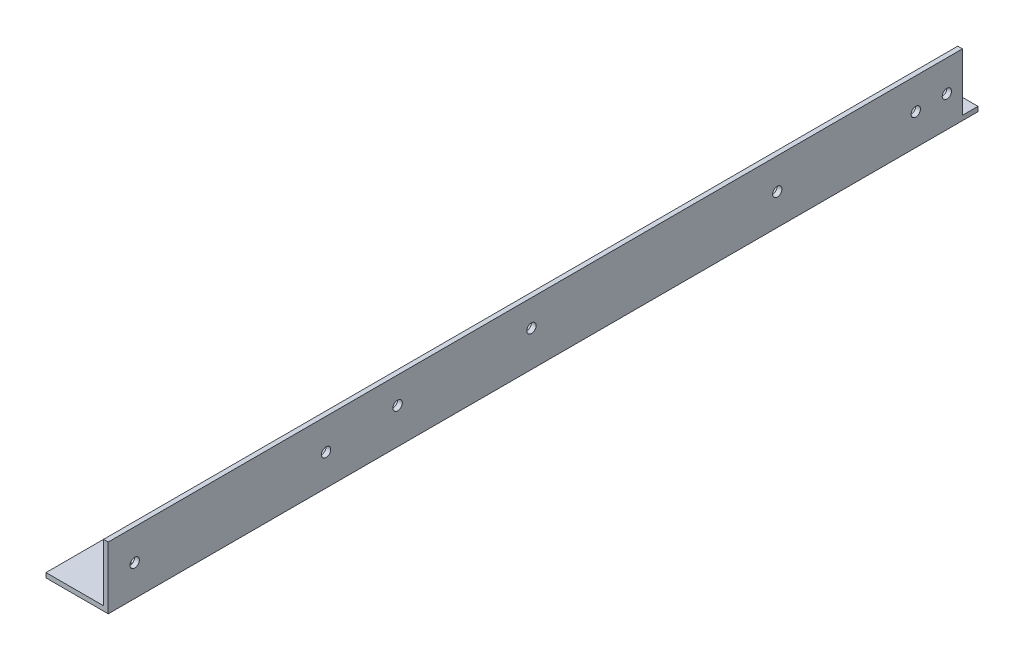
ISO-10303-21;
HEADER;
FILE_DESCRIPTION(('STEP AP214'),'2;1');
FILE_NAME('part.step','',(''),(''),'','','');
FILE_SCHEMA(('AUTOMOTIVE_DESIGN { 1 0 10303 214 1 1 1 1 }'));
ENDSEC;
DATA;
#1=APPLICATION_CONTEXT('core data for automotive mechanical design processes');
#2=APPLICATION_PROTOCOL_DEFINITION('international standard','automotive_design',2000,#1);
#3=PRODUCT_CONTEXT('',#1,'mechanical');
#4=PRODUCT('Part','Part','',(#3));
#5=PRODUCT_RELATED_PRODUCT_CATEGORY('part','',(#4));
#6=PRODUCT_DEFINITION_FORMATION('','',#4);
#7=PRODUCT_DEFINITION_CONTEXT('part definition',#1,'design');
#8=PRODUCT_DEFINITION('design','',#6,#7);
#9=PRODUCT_DEFINITION_SHAPE('','',#8);
#10=(LENGTH_UNIT() NAMED_UNIT(*) SI_UNIT(.MILLI.,.METRE.));
#11=(NAMED_UNIT(*) PLANE_ANGLE_UNIT() SI_UNIT($,.RADIAN.));
#12=(NAMED_UNIT(*) SI_UNIT($,.STERADIAN.) SOLID_ANGLE_UNIT());
#13=UNCERTAINTY_MEASURE_WITH_UNIT(LENGTH_MEASURE(1.E-05),#10,'distance_accuracy_value','');
#14=(GEOMETRIC_REPRESENTATION_CONTEXT(3) GLOBAL_UNCERTAINTY_ASSIGNED_CONTEXT((#13)) GLOBAL_UNIT_ASSIGNED_CONTEXT((#10,
#11,#12)) REPRESENTATION_CONTEXT('',''));
#15=CARTESIAN_POINT('',(0.,0.,0.));
#16=DIRECTION('',(0.,0.,1.));
#17=DIRECTION('',(1.,0.,0.));
#18=AXIS2_PLACEMENT_3D('',#15,#16,#17);
#19=CARTESIAN_POINT('',(2.56831362016425,-15.2266315789474,0.));
#20=DIRECTION('',(0.,0.,1.));
#21=DIRECTION('',(1.,0.,0.));
#22=AXIS2_PLACEMENT_3D('',#19,#20,#21);
#23=PLANE('',#22);
#24=DIRECTION('',(1.,0.,0.));
#25=VECTOR('',#24,1.);
#26=CARTESIAN_POINT('',(-17.4316863798357,-13.7266315789474,0.));
#27=LINE('',#26,#25);
#28=CARTESIAN_POINT('',(1.06831362016425,-13.7266315789474,0.));
#29=VERTEX_POINT('',#28);
#30=CARTESIAN_POINT('',(2.56831362016425,-13.7266315789474,0.));
#31=VERTEX_POINT('',#30);
#32=EDGE_CURVE('E11',#29,#31,#27,.T.);
#33=ORIENTED_EDGE('',*,*,#32,.F.);
#34=DIRECTION('',(0.,-1.,0.));
#35=VECTOR('',#34,1.);
#36=CARTESIAN_POINT('',(1.06831362016425,4.77336842105263,0.));
#37=LINE('',#36,#35);
#38=CARTESIAN_POINT('',(1.06831362016425,4.77336842105263,0.));
#39=VERTEX_POINT('',#38);
#40=EDGE_CURVE('E102',#39,#29,#37,.T.);
#41=ORIENTED_EDGE('',*,*,#40,.F.);
#42=DIRECTION('',(-1.,0.,0.));
#43=VECTOR('',#42,1.);
#44=CARTESIAN_POINT('',(2.56831362016425,4.77336842105263,0.));
#45=LINE('',#44,#43);
#46=CARTESIAN_POINT('',(2.56831362016425,4.77336842105263,0.));
#47=VERTEX_POINT('',#46);
#48=EDGE_CURVE('E64',#47,#39,#45,.T.);
#49=ORIENTED_EDGE('',*,*,#48,.F.);
#50=DIRECTION('',(0.,1.,0.));
#51=VECTOR('',#50,1.);
#52=CARTESIAN_POINT('',(2.56831362016425,-15.2266315789474,0.));
#53=LINE('',#52,#51);
#54=EDGE_CURVE('E118',#31,#47,#53,.T.);
#55=ORIENTED_EDGE('',*,*,#54,.F.);
#56=EDGE_LOOP('',(#33,#41,#49,#55));
#57=FACE_BOUND('',#56,.T.);
#58=ADVANCED_FACE('F30',(#57),#23,.F.);
#59=CARTESIAN_POINT('',(-17.4316863798357,-15.2266315789474,274.5));
#60=DIRECTION('',(0.,1.,0.));
#61=DIRECTION('',(0.,0.,1.));
#62=AXIS2_PLACEMENT_3D('',#59,#60,#61);
#63=PLANE('',#62);
#64=CARTESIAN_POINT('',(-7.43168637983575,-15.2266315789474,59.5));
#65=DIRECTION('',(0.,1.,0.));
#66=DIRECTION('',(0.,0.,1.));
#67=AXIS2_PLACEMENT_3D('',#64,#65,#66);
#68=CIRCLE('',#67,1.5);
#69=CARTESIAN_POINT('',(-7.43168637983575,-15.2266315789474,61.));
#70=VERTEX_POINT('',#69);
#71=EDGE_CURVE('E162',#70,#70,#68,.T.);
#72=ORIENTED_EDGE('',*,*,#71,.T.);
#73=EDGE_LOOP('',(#72));
#74=FACE_BOUND('',#73,.T.);
#75=CARTESIAN_POINT('',(-7.43168637983575,-15.2266315789474,204.5));
#76=DIRECTION('',(0.,1.,0.));
#77=DIRECTION('',(0.,0.,1.));
#78=AXIS2_PLACEMENT_3D('',#75,#76,#77);
#79=CIRCLE('',#78,1.5);
#80=CARTESIAN_POINT('',(-7.43168637983575,-15.2266315789474,206.));
#81=VERTEX_POINT('',#80);
#82=EDGE_CURVE('E168',#81,#81,#79,.T.);
#83=ORIENTED_EDGE('',*,*,#82,.T.);
#84=EDGE_LOOP('',(#83));
#85=FACE_BOUND('',#84,.T.);
#86=CARTESIAN_POINT('',(-4.93168637983575,-15.2266315789474,259.5));
#87=DIRECTION('',(0.,1.,0.));
#88=DIRECTION('',(0.,0.,1.));
#89=AXIS2_PLACEMENT_3D('',#86,#87,#88);
#90=CIRCLE('',#89,2.);
#91=CARTESIAN_POINT('',(-4.93168637983575,-15.2266315789474,261.5));
#92=VERTEX_POINT('',#91);
#93=EDGE_CURVE('E174',#92,#92,#90,.T.);
#94=ORIENTED_EDGE('',*,*,#93,.T.);
#95=EDGE_LOOP('',(#94));
#96=FACE_BOUND('',#95,.T.);
#97=CARTESIAN_POINT('',(-4.93168637983575,-15.2266315789474,248.5));
#98=DIRECTION('',(0.,1.,0.));
#99=DIRECTION('',(0.,0.,1.));
#100=AXIS2_PLACEMENT_3D('',#97,#98,#99);
#101=CIRCLE('',#100,2.);
#102=CARTESIAN_POINT('',(-4.93168637983575,-15.2266315789474,250.5));
#103=VERTEX_POINT('',#102);
#104=EDGE_CURVE('E180',#103,#103,#101,.T.);
#105=ORIENTED_EDGE('',*,*,#104,.T.);
#106=EDGE_LOOP('',(#105));
#107=FACE_BOUND('',#106,.T.);
#108=CARTESIAN_POINT('',(-4.93168637983575,-15.2266315789474,15.5));
#109=DIRECTION('',(0.,1.,0.));
#110=DIRECTION('',(0.,0.,1.));
#111=AXIS2_PLACEMENT_3D('',#108,#109,#110);
#112=CIRCLE('',#111,2.);
#113=CARTESIAN_POINT('',(-4.93168637983575,-15.2266315789474,17.5));
#114=VERTEX_POINT('',#113);
#115=EDGE_CURVE('E186',#114,#114,#112,.T.);
#116=ORIENTED_EDGE('',*,*,#115,.T.);
#117=EDGE_LOOP('',(#116));
#118=FACE_BOUND('',#117,.T.);
#119=CARTESIAN_POINT('',(-4.93168637983575,-15.2266315789474,4.5));
#120=DIRECTION('',(0.,1.,0.));
#121=DIRECTION('',(0.,0.,1.));
#122=AXIS2_PLACEMENT_3D('',#119,#120,#121);
#123=CIRCLE('',#122,2.);
#124=CARTESIAN_POINT('',(-4.93168637983575,-15.2266315789474,6.5));
#125=VERTEX_POINT('',#124);
#126=EDGE_CURVE('E120',#125,#125,#123,.T.);
#127=ORIENTED_EDGE('',*,*,#126,.T.);
#128=EDGE_LOOP('',(#127));
#129=FACE_BOUND('',#128,.T.);
#130=DIRECTION('',(0.,0.,-1.));
#131=VECTOR('',#130,1.);
#132=CARTESIAN_POINT('',(-17.4316863798357,-15.2266315789474,274.5));
#133=LINE('',#132,#131);
#134=CARTESIAN_POINT('',(-17.4316863798357,-15.2266315789474,274.5));
#135=VERTEX_POINT('',#134);
#136=CARTESIAN_POINT('',(-17.4316863798357,-15.2266315789474,-5.));
#137=VERTEX_POINT('',#136);
#138=EDGE_CURVE('E110',#135,#137,#133,.T.);
#139=ORIENTED_EDGE('',*,*,#138,.T.);
#140=DIRECTION('',(-1.,0.,0.));
#141=VECTOR('',#140,1.);
#142=CARTESIAN_POINT('',(-17.4316863798357,-15.2266315789474,-5.));
#143=LINE('',#142,#141);
#144=CARTESIAN_POINT('',(2.56831362016425,-15.2266315789474,-5.));
#145=VERTEX_POINT('',#144);
#146=EDGE_CURVE('E130',#145,#137,#143,.T.);
#147=ORIENTED_EDGE('',*,*,#146,.F.);
#148=DIRECTION('',(0.,0.,-1.));
#149=VECTOR('',#148,1.);
#150=CARTESIAN_POINT('',(2.56831362016425,-15.2266315789474,274.5));
#151=LINE('',#150,#149);
#152=CARTESIAN_POINT('',(2.56831362016425,-15.2266315789474,274.5));
#153=VERTEX_POINT('',#152);
#154=EDGE_CURVE('E40',#153,#145,#151,.T.);
#155=ORIENTED_EDGE('',*,*,#154,.F.);
#156=DIRECTION('',(1.,0.,0.));
#157=VECTOR('',#156,1.);
#158=CARTESIAN_POINT('',(-17.4316863798357,-15.2266315789474,274.5));
#159=LINE('',#158,#157);
#160=EDGE_CURVE('E194',#135,#153,#159,.T.);
#161=ORIENTED_EDGE('',*,*,#160,.F.);
#162=EDGE_LOOP('',(#139,#147,#155,#161));
#163=FACE_BOUND('',#162,.T.);
#164=ADVANCED_FACE('F32',(#74,#85,#96,#107,#118,#129,#163),#63,.F.);
#165=CARTESIAN_POINT('',(2.56831362016425,-15.2266315789474,274.5));
#166=DIRECTION('',(-1.,0.,0.));
#167=DIRECTION('',(0.,0.,1.));
#168=AXIS2_PLACEMENT_3D('',#165,#166,#167);
#169=PLANE('',#168);
#170=CARTESIAN_POINT('',(2.56831362016425,-3.72663157894737,138.5));
#171=DIRECTION('',(1.,0.,0.));
#172=DIRECTION('',(0.,0.,-1.));
#173=AXIS2_PLACEMENT_3D('',#170,#171,#172);
#174=CIRCLE('',#173,1.5);
#175=CARTESIAN_POINT('',(2.56831362016425,-3.72663157894737,137.));
#176=VERTEX_POINT('',#175);
#177=EDGE_CURVE('E132',#176,#176,#174,.T.);
#178=ORIENTED_EDGE('',*,*,#177,.F.);
#179=EDGE_LOOP('',(#178));
#180=FACE_BOUND('',#179,.T.);
#181=CARTESIAN_POINT('',(2.56831362016425,-3.72663157894737,181.5));
#182=DIRECTION('',(1.,0.,0.));
#183=DIRECTION('',(0.,0.,-1.));
#184=AXIS2_PLACEMENT_3D('',#181,#182,#183);
#185=CIRCLE('',#184,1.5);
#186=CARTESIAN_POINT('',(2.56831362016425,-3.72663157894737,180.));
#187=VERTEX_POINT('',#186);
#188=EDGE_CURVE('E135',#187,#187,#185,.T.);
#189=ORIENTED_EDGE('',*,*,#188,.F.);
#190=EDGE_LOOP('',(#189));
#191=FACE_BOUND('',#190,.T.);
#192=CARTESIAN_POINT('',(2.56831362016425,-5.22663157894737,204.5));
#193=DIRECTION('',(1.,0.,0.));
#194=DIRECTION('',(0.,0.,-1.));
#195=AXIS2_PLACEMENT_3D('',#192,#193,#194);
#196=CIRCLE('',#195,1.5);
#197=CARTESIAN_POINT('',(2.56831362016425,-5.22663157894737,203.));
#198=VERTEX_POINT('',#197);
#199=EDGE_CURVE('E139',#198,#198,#196,.T.);
#200=ORIENTED_EDGE('',*,*,#199,.F.);
#201=EDGE_LOOP('',(#200));
#202=FACE_BOUND('',#201,.T.);
#203=CARTESIAN_POINT('',(2.56831362016425,-5.22663157894737,59.5));
#204=DIRECTION('',(1.,0.,0.));
#205=DIRECTION('',(0.,0.,-1.));
#206=AXIS2_PLACEMENT_3D('',#203,#204,#205);
#207=CIRCLE('',#206,1.5);
#208=CARTESIAN_POINT('',(2.56831362016425,-5.22663157894737,58.));
#209=VERTEX_POINT('',#208);
#210=EDGE_CURVE('E143',#209,#209,#207,.T.);
#211=ORIENTED_EDGE('',*,*,#210,.F.);
#212=EDGE_LOOP('',(#211));
#213=FACE_BOUND('',#212,.T.);
#214=CARTESIAN_POINT('',(2.56831362016425,-5.22663157894737,15.));
#215=DIRECTION('',(1.,0.,0.));
#216=DIRECTION('',(0.,0.,-1.));
#217=AXIS2_PLACEMENT_3D('',#214,#215,#216);
#218=CIRCLE('',#217,1.5);
#219=CARTESIAN_POINT('',(2.56831362016425,-5.22663157894737,13.5));
#220=VERTEX_POINT('',#219);
#221=EDGE_CURVE('E147',#220,#220,#218,.T.);
#222=ORIENTED_EDGE('',*,*,#221,.F.);
#223=EDGE_LOOP('',(#222));
#224=FACE_BOUND('',#223,.T.);
#225=CARTESIAN_POINT('',(2.56831362016425,-5.22663157894737,5.));
#226=DIRECTION('',(1.,0.,0.));
#227=DIRECTION('',(0.,0.,-1.));
#228=AXIS2_PLACEMENT_3D('',#225,#226,#227);
#229=CIRCLE('',#228,1.5);
#230=CARTESIAN_POINT('',(2.56831362016425,-5.22663157894737,3.5));
#231=VERTEX_POINT('',#230);
#232=EDGE_CURVE('E151',#231,#231,#229,.T.);
#233=ORIENTED_EDGE('',*,*,#232,.F.);
#234=EDGE_LOOP('',(#233));
#235=FACE_BOUND('',#234,.T.);
#236=CARTESIAN_POINT('',(2.56831362016425,-5.22663157894737,266.));
#237=DIRECTION('',(1.,0.,0.));
#238=DIRECTION('',(0.,0.,-1.));
#239=AXIS2_PLACEMENT_3D('',#236,#237,#238);
#240=CIRCLE('',#239,1.50000000000002);
#241=CARTESIAN_POINT('',(2.56831362016425,-5.22663157894737,264.5));
#242=VERTEX_POINT('',#241);
#243=EDGE_CURVE('E155',#242,#242,#240,.T.);
#244=ORIENTED_EDGE('',*,*,#243,.F.);
#245=EDGE_LOOP('',(#244));
#246=FACE_BOUND('',#245,.T.);
#247=ORIENTED_EDGE('',*,*,#154,.T.);
#248=DIRECTION('',(0.,-1.,0.));
#249=VECTOR('',#248,1.);
#250=CARTESIAN_POINT('',(2.56831362016425,-15.2266315789474,-5.));
#251=LINE('',#250,#249);
#252=CARTESIAN_POINT('',(2.56831362016425,-13.7266315789474,-5.));
#253=VERTEX_POINT('',#252);
#254=EDGE_CURVE('E332',#253,#145,#251,.T.);
#255=ORIENTED_EDGE('',*,*,#254,.F.);
#256=DIRECTION('',(0.,0.,1.));
#257=VECTOR('',#256,1.);
#258=CARTESIAN_POINT('',(2.56831362016425,-13.7266315789474,-5.));
#259=LINE('',#258,#257);
#260=EDGE_CURVE('E125',#253,#31,#259,.T.);
#261=ORIENTED_EDGE('',*,*,#260,.T.);
#262=ORIENTED_EDGE('',*,*,#54,.T.);
#263=DIRECTION('',(0.,0.,-1.));
#264=VECTOR('',#263,1.);
#265=CARTESIAN_POINT('',(2.56831362016425,4.77336842105263,274.5));
#266=LINE('',#265,#264);
#267=CARTESIAN_POINT('',(2.56831362016425,4.77336842105263,274.5));
#268=VERTEX_POINT('',#267);
#269=EDGE_CURVE('E198',#268,#47,#266,.T.);
#270=ORIENTED_EDGE('',*,*,#269,.F.);
#271=DIRECTION('',(0.,1.,0.));
#272=VECTOR('',#271,1.);
#273=CARTESIAN_POINT('',(2.56831362016425,-15.2266315789474,274.5));
#274=LINE('',#273,#272);
#275=EDGE_CURVE('E79',#153,#268,#274,.T.);
#276=ORIENTED_EDGE('',*,*,#275,.F.);
#277=EDGE_LOOP('',(#247,#255,#261,#262,#270,#276));
#278=FACE_BOUND('',#277,.T.);
#279=ADVANCED_FACE('F199',(#180,#191,#202,#213,#224,#235,#246,#278),#169,.F.);
#280=CARTESIAN_POINT('',(2.56831362016425,4.77336842105263,274.5));
#281=DIRECTION('',(0.,-1.,0.));
#282=DIRECTION('',(0.,0.,-1.));
#283=AXIS2_PLACEMENT_3D('',#280,#281,#282);
#284=PLANE('',#283);
#285=ORIENTED_EDGE('',*,*,#48,.T.);
#286=DIRECTION('',(0.,0.,-1.));
#287=VECTOR('',#286,1.);
#288=CARTESIAN_POINT('',(1.06831362016425,4.77336842105263,274.5));
#289=LINE('',#288,#287);
#290=CARTESIAN_POINT('',(1.06831362016425,4.77336842105263,274.5));
#291=VERTEX_POINT('',#290);
#292=EDGE_CURVE('E104',#291,#39,#289,.T.);
#293=ORIENTED_EDGE('',*,*,#292,.F.);
#294=DIRECTION('',(-1.,0.,0.));
#295=VECTOR('',#294,1.);
#296=CARTESIAN_POINT('',(2.56831362016425,4.77336842105263,274.5));
#297=LINE('',#296,#295);
#298=EDGE_CURVE('E96',#268,#291,#297,.T.);
#299=ORIENTED_EDGE('',*,*,#298,.F.);
#300=ORIENTED_EDGE('',*,*,#269,.T.);
#301=EDGE_LOOP('',(#285,#293,#299,#300));
#302=FACE_BOUND('',#301,.T.);
#303=ADVANCED_FACE('F202',(#302),#284,.F.);
#304=CARTESIAN_POINT('',(1.06831362016425,4.77336842105263,274.5));
#305=DIRECTION('',(1.,0.,0.));
#306=DIRECTION('',(0.,0.,-1.));
#307=AXIS2_PLACEMENT_3D('',#304,#305,#306);
#308=PLANE('',#307);
#309=CARTESIAN_POINT('',(1.06831362016425,-3.72663157894737,138.5));
#310=DIRECTION('',(1.,0.,0.));
#311=DIRECTION('',(0.,0.,-1.));
#312=AXIS2_PLACEMENT_3D('',#309,#310,#311);
#313=CIRCLE('',#312,1.5);
#314=CARTESIAN_POINT('',(1.06831362016425,-3.72663157894737,137.));
#315=VERTEX_POINT('',#314);
#316=EDGE_CURVE('E121',#315,#315,#313,.T.);
#317=ORIENTED_EDGE('',*,*,#316,.T.);
#318=EDGE_LOOP('',(#317));
#319=FACE_BOUND('',#318,.T.);
#320=CARTESIAN_POINT('',(1.06831362016425,-3.72663157894737,181.5));
#321=DIRECTION('',(1.,0.,0.));
#322=DIRECTION('',(0.,0.,-1.));
#323=AXIS2_PLACEMENT_3D('',#320,#321,#322);
#324=CIRCLE('',#323,1.5);
#325=CARTESIAN_POINT('',(1.06831362016425,-3.72663157894737,180.));
#326=VERTEX_POINT('',#325);
#327=EDGE_CURVE('E138',#326,#326,#324,.T.);
#328=ORIENTED_EDGE('',*,*,#327,.T.);
#329=EDGE_LOOP('',(#328));
#330=FACE_BOUND('',#329,.T.);
#331=CARTESIAN_POINT('',(1.06831362016425,-5.22663157894737,204.5));
#332=DIRECTION('',(1.,0.,0.));
#333=DIRECTION('',(0.,0.,-1.));
#334=AXIS2_PLACEMENT_3D('',#331,#332,#333);
#335=CIRCLE('',#334,1.5);
#336=CARTESIAN_POINT('',(1.06831362016425,-5.22663157894737,203.));
#337=VERTEX_POINT('',#336);
#338=EDGE_CURVE('E142',#337,#337,#335,.T.);
#339=ORIENTED_EDGE('',*,*,#338,.T.);
#340=EDGE_LOOP('',(#339));
#341=FACE_BOUND('',#340,.T.);
#342=CARTESIAN_POINT('',(1.06831362016425,-5.22663157894737,59.5));
#343=DIRECTION('',(1.,0.,0.));
#344=DIRECTION('',(0.,0.,-1.));
#345=AXIS2_PLACEMENT_3D('',#342,#343,#344);
#346=CIRCLE('',#345,1.5);
#347=CARTESIAN_POINT('',(1.06831362016425,-5.22663157894737,58.));
#348=VERTEX_POINT('',#347);
#349=EDGE_CURVE('E146',#348,#348,#346,.T.);
#350=ORIENTED_EDGE('',*,*,#349,.T.);
#351=EDGE_LOOP('',(#350));
#352=FACE_BOUND('',#351,.T.);
#353=CARTESIAN_POINT('',(1.06831362016425,-5.22663157894737,15.));
#354=DIRECTION('',(1.,0.,0.));
#355=DIRECTION('',(0.,0.,-1.));
#356=AXIS2_PLACEMENT_3D('',#353,#354,#355);
#357=CIRCLE('',#356,1.5);
#358=CARTESIAN_POINT('',(1.06831362016425,-5.22663157894737,13.5));
#359=VERTEX_POINT('',#358);
#360=EDGE_CURVE('E150',#359,#359,#357,.T.);
#361=ORIENTED_EDGE('',*,*,#360,.T.);
#362=EDGE_LOOP('',(#361));
#363=FACE_BOUND('',#362,.T.);
#364=CARTESIAN_POINT('',(1.06831362016425,-5.22663157894737,5.));
#365=DIRECTION('',(1.,0.,0.));
#366=DIRECTION('',(0.,0.,-1.));
#367=AXIS2_PLACEMENT_3D('',#364,#365,#366);
#368=CIRCLE('',#367,1.5);
#369=CARTESIAN_POINT('',(1.06831362016425,-5.22663157894737,3.5));
#370=VERTEX_POINT('',#369);
#371=EDGE_CURVE('E154',#370,#370,#368,.T.);
#372=ORIENTED_EDGE('',*,*,#371,.T.);
#373=EDGE_LOOP('',(#372));
#374=FACE_BOUND('',#373,.T.);
#375=CARTESIAN_POINT('',(1.06831362016425,-5.22663157894737,266.));
#376=DIRECTION('',(1.,0.,0.));
#377=DIRECTION('',(0.,0.,-1.));
#378=AXIS2_PLACEMENT_3D('',#375,#376,#377);
#379=CIRCLE('',#378,1.50000000000002);
#380=CARTESIAN_POINT('',(1.06831362016425,-5.22663157894737,264.5));
#381=VERTEX_POINT('',#380);
#382=EDGE_CURVE('E158',#381,#381,#379,.T.);
#383=ORIENTED_EDGE('',*,*,#382,.T.);
#384=EDGE_LOOP('',(#383));
#385=FACE_BOUND('',#384,.T.);
#386=ORIENTED_EDGE('',*,*,#40,.T.);
#387=DIRECTION('',(0.,0.,-1.));
#388=VECTOR('',#387,1.);
#389=CARTESIAN_POINT('',(1.06831362016425,-13.7266315789474,274.5));
#390=LINE('',#389,#388);
#391=CARTESIAN_POINT('',(1.06831362016425,-13.7266315789474,274.5));
#392=VERTEX_POINT('',#391);
#393=EDGE_CURVE('E100',#392,#29,#390,.T.);
#394=ORIENTED_EDGE('',*,*,#393,.F.);
#395=DIRECTION('',(0.,-1.,0.));
#396=VECTOR('',#395,1.);
#397=CARTESIAN_POINT('',(1.06831362016425,4.77336842105263,274.5));
#398=LINE('',#397,#396);
#399=EDGE_CURVE('E89',#291,#392,#398,.T.);
#400=ORIENTED_EDGE('',*,*,#399,.F.);
#401=ORIENTED_EDGE('',*,*,#292,.T.);
#402=EDGE_LOOP('',(#386,#394,#400,#401));
#403=FACE_BOUND('',#402,.T.);
#404=ADVANCED_FACE('F101',(#319,#330,#341,#352,#363,#374,#385,#403),#308,.F.);
#405=CARTESIAN_POINT('',(1.06831362016425,-13.7266315789474,274.5));
#406=DIRECTION('',(0.,-1.,0.));
#407=DIRECTION('',(0.,0.,-1.));
#408=AXIS2_PLACEMENT_3D('',#405,#406,#407);
#409=PLANE('',#408);
#410=CARTESIAN_POINT('',(-7.43168637983575,-13.7266315789474,59.5));
#411=DIRECTION('',(0.,1.,0.));
#412=DIRECTION('',(-1.,0.,0.));
#413=AXIS2_PLACEMENT_3D('',#410,#411,#412);
#414=CIRCLE('',#413,1.5);
#415=CARTESIAN_POINT('',(-8.93168637983575,-13.7266315789474,59.5));
#416=VERTEX_POINT('',#415);
#417=EDGE_CURVE('E159',#416,#416,#414,.T.);
#418=ORIENTED_EDGE('',*,*,#417,.F.);
#419=EDGE_LOOP('',(#418));
#420=FACE_BOUND('',#419,.T.);
#421=CARTESIAN_POINT('',(-7.43168637983575,-13.7266315789474,204.5));
#422=DIRECTION('',(0.,1.,0.));
#423=DIRECTION('',(-1.,0.,0.));
#424=AXIS2_PLACEMENT_3D('',#421,#422,#423);
#425=CIRCLE('',#424,1.5);
#426=CARTESIAN_POINT('',(-8.93168637983575,-13.7266315789474,204.5));
#427=VERTEX_POINT('',#426);
#428=EDGE_CURVE('E165',#427,#427,#425,.T.);
#429=ORIENTED_EDGE('',*,*,#428,.F.);
#430=EDGE_LOOP('',(#429));
#431=FACE_BOUND('',#430,.T.);
#432=CARTESIAN_POINT('',(-4.93168637983575,-13.7266315789474,259.5));
#433=DIRECTION('',(0.,1.,0.));
#434=DIRECTION('',(-1.,0.,0.));
#435=AXIS2_PLACEMENT_3D('',#432,#433,#434);
#436=CIRCLE('',#435,2.);
#437=CARTESIAN_POINT('',(-6.93168637983575,-13.7266315789474,259.5));
#438=VERTEX_POINT('',#437);
#439=EDGE_CURVE('E171',#438,#438,#436,.T.);
#440=ORIENTED_EDGE('',*,*,#439,.F.);
#441=EDGE_LOOP('',(#440));
#442=FACE_BOUND('',#441,.T.);
#443=CARTESIAN_POINT('',(-4.93168637983575,-13.7266315789474,248.5));
#444=DIRECTION('',(0.,1.,0.));
#445=DIRECTION('',(-1.,0.,0.));
#446=AXIS2_PLACEMENT_3D('',#443,#444,#445);
#447=CIRCLE('',#446,2.);
#448=CARTESIAN_POINT('',(-6.93168637983575,-13.7266315789474,248.5));
#449=VERTEX_POINT('',#448);
#450=EDGE_CURVE('E177',#449,#449,#447,.T.);
#451=ORIENTED_EDGE('',*,*,#450,.F.);
#452=EDGE_LOOP('',(#451));
#453=FACE_BOUND('',#452,.T.);
#454=CARTESIAN_POINT('',(-4.93168637983575,-13.7266315789474,15.5));
#455=DIRECTION('',(0.,1.,0.));
#456=DIRECTION('',(-1.,0.,0.));
#457=AXIS2_PLACEMENT_3D('',#454,#455,#456);
#458=CIRCLE('',#457,2.);
#459=CARTESIAN_POINT('',(-6.93168637983575,-13.7266315789474,15.5));
#460=VERTEX_POINT('',#459);
#461=EDGE_CURVE('E183',#460,#460,#458,.T.);
#462=ORIENTED_EDGE('',*,*,#461,.F.);
#463=EDGE_LOOP('',(#462));
#464=FACE_BOUND('',#463,.T.);
#465=CARTESIAN_POINT('',(-4.93168637983575,-13.7266315789474,4.5));
#466=DIRECTION('',(0.,1.,0.));
#467=DIRECTION('',(-1.,0.,0.));
#468=AXIS2_PLACEMENT_3D('',#465,#466,#467);
#469=CIRCLE('',#468,2.);
#470=CARTESIAN_POINT('',(-6.93168637983575,-13.7266315789474,4.5));
#471=VERTEX_POINT('',#470);
#472=EDGE_CURVE('E189',#471,#471,#469,.T.);
#473=ORIENTED_EDGE('',*,*,#472,.F.);
#474=EDGE_LOOP('',(#473));
#475=FACE_BOUND('',#474,.T.);
#476=ORIENTED_EDGE('',*,*,#393,.T.);
#477=ORIENTED_EDGE('',*,*,#32,.T.);
#478=ORIENTED_EDGE('',*,*,#260,.F.);
#479=DIRECTION('',(1.,0.,0.));
#480=VECTOR('',#479,1.);
#481=CARTESIAN_POINT('',(-17.4316863798357,-13.7266315789474,-5.));
#482=LINE('',#481,#480);
#483=CARTESIAN_POINT('',(-17.4316863798357,-13.7266315789474,-5.));
#484=VERTEX_POINT('',#483);
#485=EDGE_CURVE('E333',#484,#253,#482,.T.);
#486=ORIENTED_EDGE('',*,*,#485,.F.);
#487=DIRECTION('',(0.,0.,-1.));
#488=VECTOR('',#487,1.);
#489=CARTESIAN_POINT('',(-17.4316863798357,-13.7266315789474,274.5));
#490=LINE('',#489,#488);
#491=CARTESIAN_POINT('',(-17.4316863798357,-13.7266315789474,274.5));
#492=VERTEX_POINT('',#491);
#493=EDGE_CURVE('E105',#492,#484,#490,.T.);
#494=ORIENTED_EDGE('',*,*,#493,.F.);
#495=DIRECTION('',(-1.,0.,0.));
#496=VECTOR('',#495,1.);
#497=CARTESIAN_POINT('',(1.06831362016425,-13.7266315789474,274.5));
#498=LINE('',#497,#496);
#499=EDGE_CURVE('E93',#392,#492,#498,.T.);
#500=ORIENTED_EDGE('',*,*,#499,.F.);
#501=EDGE_LOOP('',(#476,#477,#478,#486,#494,#500));
#502=FACE_BOUND('',#501,.T.);
#503=ADVANCED_FACE('F106',(#420,#431,#442,#453,#464,#475,#502),#409,.F.);
#504=CARTESIAN_POINT('',(-17.4316863798357,-13.7266315789474,274.5));
#505=DIRECTION('',(1.,0.,0.));
#506=DIRECTION('',(0.,0.,-1.));
#507=AXIS2_PLACEMENT_3D('',#504,#505,#506);
#508=PLANE('',#507);
#509=ORIENTED_EDGE('',*,*,#493,.T.);
#510=DIRECTION('',(0.,1.,0.));
#511=VECTOR('',#510,1.);
#512=CARTESIAN_POINT('',(-17.4316863798357,-15.2266315789474,-5.));
#513=LINE('',#512,#511);
#514=EDGE_CURVE('E330',#137,#484,#513,.T.);
#515=ORIENTED_EDGE('',*,*,#514,.F.);
#516=ORIENTED_EDGE('',*,*,#138,.F.);
#517=DIRECTION('',(0.,-1.,0.));
#518=VECTOR('',#517,1.);
#519=CARTESIAN_POINT('',(-17.4316863798357,-13.7266315789474,274.5));
#520=LINE('',#519,#518);
#521=EDGE_CURVE('E49',#492,#135,#520,.T.);
#522=ORIENTED_EDGE('',*,*,#521,.F.);
#523=EDGE_LOOP('',(#509,#515,#516,#522));
#524=FACE_BOUND('',#523,.T.);
#525=ADVANCED_FACE('F246',(#524),#508,.F.);
#526=CARTESIAN_POINT('',(2.56831362016425,-15.2266315789474,274.5));
#527=DIRECTION('',(0.,0.,1.));
#528=DIRECTION('',(1.,0.,0.));
#529=AXIS2_PLACEMENT_3D('',#526,#527,#528);
#530=PLANE('',#529);
#531=ORIENTED_EDGE('',*,*,#160,.T.);
#532=ORIENTED_EDGE('',*,*,#275,.T.);
#533=ORIENTED_EDGE('',*,*,#298,.T.);
#534=ORIENTED_EDGE('',*,*,#399,.T.);
#535=ORIENTED_EDGE('',*,*,#499,.T.);
#536=ORIENTED_EDGE('',*,*,#521,.T.);
#537=EDGE_LOOP('',(#531,#532,#533,#534,#535,#536));
#538=FACE_BOUND('',#537,.T.);
#539=ADVANCED_FACE('F91',(#538),#530,.T.);
#540=CARTESIAN_POINT('',(-4.93168637983563,-313.726631578947,4.5));
#541=DIRECTION('',(0.,1.,0.));
#542=DIRECTION('',(-1.,0.,0.));
#543=AXIS2_PLACEMENT_3D('',#540,#541,#542);
#544=CYLINDRICAL_SURFACE('',#543,2.);
#545=ORIENTED_EDGE('',*,*,#472,.T.);
#546=EDGE_LOOP('',(#545));
#547=FACE_BOUND('',#546,.T.);
#548=ORIENTED_EDGE('',*,*,#126,.F.);
#549=EDGE_LOOP('',(#548));
#550=FACE_BOUND('',#549,.T.);
#551=ADVANCED_FACE('F308',(#547,#550),#544,.F.);
#552=CARTESIAN_POINT('',(-4.93168637983563,-313.726631578947,15.5));
#553=DIRECTION('',(0.,1.,0.));
#554=DIRECTION('',(-1.,0.,0.));
#555=AXIS2_PLACEMENT_3D('',#552,#553,#554);
#556=CYLINDRICAL_SURFACE('',#555,2.);
#557=ORIENTED_EDGE('',*,*,#461,.T.);
#558=EDGE_LOOP('',(#557));
#559=FACE_BOUND('',#558,.T.);
#560=ORIENTED_EDGE('',*,*,#115,.F.);
#561=EDGE_LOOP('',(#560));
#562=FACE_BOUND('',#561,.T.);
#563=ADVANCED_FACE('F305',(#559,#562),#556,.F.);
#564=CARTESIAN_POINT('',(-4.93168637983563,-313.726631578947,248.5));
#565=DIRECTION('',(0.,1.,0.));
#566=DIRECTION('',(-1.,0.,0.));
#567=AXIS2_PLACEMENT_3D('',#564,#565,#566);
#568=CYLINDRICAL_SURFACE('',#567,2.);
#569=ORIENTED_EDGE('',*,*,#450,.T.);
#570=EDGE_LOOP('',(#569));
#571=FACE_BOUND('',#570,.T.);
#572=ORIENTED_EDGE('',*,*,#104,.F.);
#573=EDGE_LOOP('',(#572));
#574=FACE_BOUND('',#573,.T.);
#575=ADVANCED_FACE('F301',(#571,#574),#568,.F.);
#576=CARTESIAN_POINT('',(-4.93168637983563,-313.726631578947,259.5));
#577=DIRECTION('',(0.,1.,0.));
#578=DIRECTION('',(-1.,0.,0.));
#579=AXIS2_PLACEMENT_3D('',#576,#577,#578);
#580=CYLINDRICAL_SURFACE('',#579,2.);
#581=ORIENTED_EDGE('',*,*,#439,.T.);
#582=EDGE_LOOP('',(#581));
#583=FACE_BOUND('',#582,.T.);
#584=ORIENTED_EDGE('',*,*,#93,.F.);
#585=EDGE_LOOP('',(#584));
#586=FACE_BOUND('',#585,.T.);
#587=ADVANCED_FACE('F297',(#583,#586),#580,.F.);
#588=CARTESIAN_POINT('',(-7.43168637983564,-313.726631578947,204.5));
#589=DIRECTION('',(0.,1.,0.));
#590=DIRECTION('',(-1.,0.,0.));
#591=AXIS2_PLACEMENT_3D('',#588,#589,#590);
#592=CYLINDRICAL_SURFACE('',#591,1.5);
#593=ORIENTED_EDGE('',*,*,#428,.T.);
#594=EDGE_LOOP('',(#593));
#595=FACE_BOUND('',#594,.T.);
#596=ORIENTED_EDGE('',*,*,#82,.F.);
#597=EDGE_LOOP('',(#596));
#598=FACE_BOUND('',#597,.T.);
#599=ADVANCED_FACE('F290',(#595,#598),#592,.F.);
#600=CARTESIAN_POINT('',(-7.43168637983563,-313.726631578947,59.5));
#601=DIRECTION('',(0.,1.,0.));
#602=DIRECTION('',(-1.,0.,0.));
#603=AXIS2_PLACEMENT_3D('',#600,#601,#602);
#604=CYLINDRICAL_SURFACE('',#603,1.5);
#605=ORIENTED_EDGE('',*,*,#417,.T.);
#606=EDGE_LOOP('',(#605));
#607=FACE_BOUND('',#606,.T.);
#608=ORIENTED_EDGE('',*,*,#71,.F.);
#609=EDGE_LOOP('',(#608));
#610=FACE_BOUND('',#609,.T.);
#611=ADVANCED_FACE('F279',(#607,#610),#604,.F.);
#612=CARTESIAN_POINT('',(-7.43168637983575,-5.22663157894737,266.));
#613=DIRECTION('',(1.,0.,0.));
#614=DIRECTION('',(0.,0.,-1.));
#615=AXIS2_PLACEMENT_3D('',#612,#613,#614);
#616=CYLINDRICAL_SURFACE('',#615,1.50000000000002);
#617=ORIENTED_EDGE('',*,*,#243,.T.);
#618=EDGE_LOOP('',(#617));
#619=FACE_BOUND('',#618,.T.);
#620=ORIENTED_EDGE('',*,*,#382,.F.);
#621=EDGE_LOOP('',(#620));
#622=FACE_BOUND('',#621,.T.);
#623=ADVANCED_FACE('F275',(#619,#622),#616,.F.);
#624=CARTESIAN_POINT('',(-7.43168637983575,-5.22663157894737,5.));
#625=DIRECTION('',(1.,0.,0.));
#626=DIRECTION('',(0.,0.,-1.));
#627=AXIS2_PLACEMENT_3D('',#624,#625,#626);
#628=CYLINDRICAL_SURFACE('',#627,1.5);
#629=ORIENTED_EDGE('',*,*,#232,.T.);
#630=EDGE_LOOP('',(#629));
#631=FACE_BOUND('',#630,.T.);
#632=ORIENTED_EDGE('',*,*,#371,.F.);
#633=EDGE_LOOP('',(#632));
#634=FACE_BOUND('',#633,.T.);
#635=ADVANCED_FACE('F278',(#631,#634),#628,.F.);
#636=CARTESIAN_POINT('',(-7.43168637983575,-5.22663157894737,15.));
#637=DIRECTION('',(1.,0.,0.));
#638=DIRECTION('',(0.,0.,-1.));
#639=AXIS2_PLACEMENT_3D('',#636,#637,#638);
#640=CYLINDRICAL_SURFACE('',#639,1.5);
#641=ORIENTED_EDGE('',*,*,#221,.T.);
#642=EDGE_LOOP('',(#641));
#643=FACE_BOUND('',#642,.T.);
#644=ORIENTED_EDGE('',*,*,#360,.F.);
#645=EDGE_LOOP('',(#644));
#646=FACE_BOUND('',#645,.T.);
#647=ADVANCED_FACE('F287',(#643,#646),#640,.F.);
#648=CARTESIAN_POINT('',(-7.43168637983575,-5.22663157894737,59.5));
#649=DIRECTION('',(1.,0.,0.));
#650=DIRECTION('',(0.,0.,-1.));
#651=AXIS2_PLACEMENT_3D('',#648,#649,#650);
#652=CYLINDRICAL_SURFACE('',#651,1.5);
#653=ORIENTED_EDGE('',*,*,#210,.T.);
#654=EDGE_LOOP('',(#653));
#655=FACE_BOUND('',#654,.T.);
#656=ORIENTED_EDGE('',*,*,#349,.F.);
#657=EDGE_LOOP('',(#656));
#658=FACE_BOUND('',#657,.T.);
#659=ADVANCED_FACE('F234',(#655,#658),#652,.F.);
#660=CARTESIAN_POINT('',(-7.43168637983575,-5.22663157894737,204.5));
#661=DIRECTION('',(1.,0.,0.));
#662=DIRECTION('',(0.,0.,-1.));
#663=AXIS2_PLACEMENT_3D('',#660,#661,#662);
#664=CYLINDRICAL_SURFACE('',#663,1.5);
#665=ORIENTED_EDGE('',*,*,#199,.T.);
#666=EDGE_LOOP('',(#665));
#667=FACE_BOUND('',#666,.T.);
#668=ORIENTED_EDGE('',*,*,#338,.F.);
#669=EDGE_LOOP('',(#668));
#670=FACE_BOUND('',#669,.T.);
#671=ADVANCED_FACE('F224',(#667,#670),#664,.F.);
#672=CARTESIAN_POINT('',(-7.43168637983575,-3.72663157894737,181.5));
#673=DIRECTION('',(1.,0.,0.));
#674=DIRECTION('',(0.,0.,-1.));
#675=AXIS2_PLACEMENT_3D('',#672,#673,#674);
#676=CYLINDRICAL_SURFACE('',#675,1.5);
#677=ORIENTED_EDGE('',*,*,#188,.T.);
#678=EDGE_LOOP('',(#677));
#679=FACE_BOUND('',#678,.T.);
#680=ORIENTED_EDGE('',*,*,#327,.F.);
#681=EDGE_LOOP('',(#680));
#682=FACE_BOUND('',#681,.T.);
#683=ADVANCED_FACE('F221',(#679,#682),#676,.F.);
#684=CARTESIAN_POINT('',(-7.43168637983575,-3.72663157894737,138.5));
#685=DIRECTION('',(1.,0.,0.));
#686=DIRECTION('',(0.,0.,-1.));
#687=AXIS2_PLACEMENT_3D('',#684,#685,#686);
#688=CYLINDRICAL_SURFACE('',#687,1.5);
#689=ORIENTED_EDGE('',*,*,#177,.T.);
#690=EDGE_LOOP('',(#689));
#691=FACE_BOUND('',#690,.T.);
#692=ORIENTED_EDGE('',*,*,#316,.F.);
#693=EDGE_LOOP('',(#692));
#694=FACE_BOUND('',#693,.T.);
#695=ADVANCED_FACE('F223',(#691,#694),#688,.F.);
#696=CARTESIAN_POINT('',(-17.4316863798357,-13.7266315789474,-5.));
#697=DIRECTION('',(0.,0.,-1.));
#698=DIRECTION('',(-1.,0.,0.));
#699=AXIS2_PLACEMENT_3D('',#696,#697,#698);
#700=PLANE('',#699);
#701=ORIENTED_EDGE('',*,*,#514,.T.);
#702=ORIENTED_EDGE('',*,*,#485,.T.);
#703=ORIENTED_EDGE('',*,*,#254,.T.);
#704=ORIENTED_EDGE('',*,*,#146,.T.);
#705=EDGE_LOOP('',(#701,#702,#703,#704));
#706=FACE_BOUND('',#705,.T.);
#707=ADVANCED_FACE('F231',(#706),#700,.T.);
#708=CLOSED_SHELL('',(#58,#164,#279,#303,#404,#503,#525,#539,#551,#563,#575,#587,#599,#611,#623,
#635,#647,#659,#671,#683,#695,#707));
#709=MANIFOLD_SOLID_BREP('B2',#708);
#710=ADVANCED_BREP_SHAPE_REPRESENTATION('',(#18,#709),#14);
#711=SHAPE_DEFINITION_REPRESENTATION(#9,#710);
ENDSEC;
END-ISO-10303-21;
